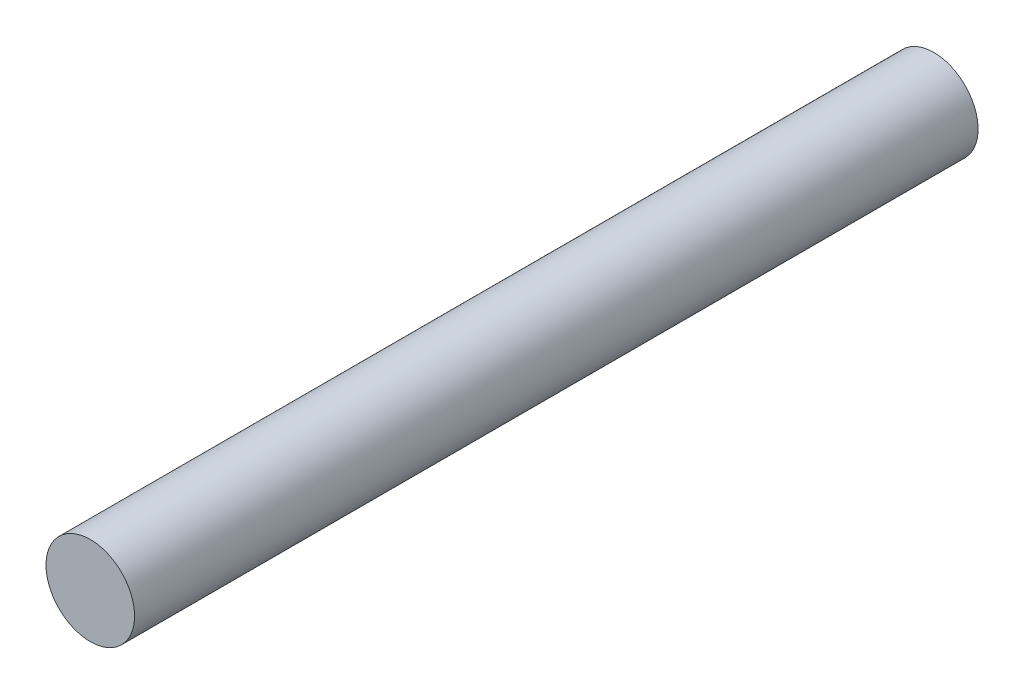
ISO-10303-21;
HEADER;
FILE_DESCRIPTION(('STEP AP214'),'2;1');
FILE_NAME('part.step','',(''),(''),'','','');
FILE_SCHEMA(('AUTOMOTIVE_DESIGN { 1 0 10303 214 1 1 1 1 }'));
ENDSEC;
DATA;
#1=APPLICATION_CONTEXT('core data for automotive mechanical design processes');
#2=APPLICATION_PROTOCOL_DEFINITION('international standard','automotive_design',2000,#1);
#3=PRODUCT_CONTEXT('',#1,'mechanical');
#4=PRODUCT('Part','Part','',(#3));
#5=PRODUCT_RELATED_PRODUCT_CATEGORY('part','',(#4));
#6=PRODUCT_DEFINITION_FORMATION('','',#4);
#7=PRODUCT_DEFINITION_CONTEXT('part definition',#1,'design');
#8=PRODUCT_DEFINITION('design','',#6,#7);
#9=PRODUCT_DEFINITION_SHAPE('','',#8);
#10=(LENGTH_UNIT() NAMED_UNIT(*) SI_UNIT(.MILLI.,.METRE.));
#11=(NAMED_UNIT(*) PLANE_ANGLE_UNIT() SI_UNIT($,.RADIAN.));
#12=(NAMED_UNIT(*) SI_UNIT($,.STERADIAN.) SOLID_ANGLE_UNIT());
#13=UNCERTAINTY_MEASURE_WITH_UNIT(LENGTH_MEASURE(1.E-05),#10,'distance_accuracy_value','');
#14=(GEOMETRIC_REPRESENTATION_CONTEXT(3) GLOBAL_UNCERTAINTY_ASSIGNED_CONTEXT((#13)) GLOBAL_UNIT_ASSIGNED_CONTEXT((#10,
#11,#12)) REPRESENTATION_CONTEXT('',''));
#15=CARTESIAN_POINT('',(0.,0.,0.));
#16=DIRECTION('',(0.,0.,1.));
#17=DIRECTION('',(1.,0.,0.));
#18=AXIS2_PLACEMENT_3D('',#15,#16,#17);
#19=CARTESIAN_POINT('',(0.,0.,76.2));
#20=DIRECTION('',(0.,0.,-1.));
#21=DIRECTION('',(-1.,0.,0.));
#22=AXIS2_PLACEMENT_3D('',#19,#20,#21);
#23=CYLINDRICAL_SURFACE('',#22,4.);
#24=CARTESIAN_POINT('',(0.,0.,76.2));
#25=DIRECTION('',(0.,0.,1.));
#26=DIRECTION('',(1.,0.,0.));
#27=AXIS2_PLACEMENT_3D('',#24,#25,#26);
#28=CIRCLE('',#27,4.);
#29=CARTESIAN_POINT('',(-4.,0.,76.2));
#30=VERTEX_POINT('',#29);
#31=EDGE_CURVE('E10',#30,#30,#28,.T.);
#32=CARTESIAN_POINT('',(0.,0.,0.));
#33=DIRECTION('',(0.,0.,1.));
#34=DIRECTION('',(1.,0.,0.));
#35=AXIS2_PLACEMENT_3D('',#32,#33,#34);
#36=CIRCLE('',#35,4.);
#37=CARTESIAN_POINT('',(-4.,0.,0.));
#38=VERTEX_POINT('',#37);
#39=EDGE_CURVE('E40',#38,#38,#36,.T.);
#40=CARTESIAN_POINT('',(-4.,0.,76.2));
#41=CARTESIAN_POINT('',(-4.,0.,75.40625));
#42=CARTESIAN_POINT('',(-4.,0.,74.6125));
#43=CARTESIAN_POINT('',(-4.,0.,73.025));
#44=CARTESIAN_POINT('',(-4.,0.,72.23125));
#45=CARTESIAN_POINT('',(-4.,0.,70.64375));
#46=CARTESIAN_POINT('',(-4.,0.,69.85));
#47=CARTESIAN_POINT('',(-4.,0.,68.2625));
#48=CARTESIAN_POINT('',(-4.,0.,67.46875));
#49=CARTESIAN_POINT('',(-4.,0.,65.88125));
#50=CARTESIAN_POINT('',(-4.,0.,65.0875));
#51=CARTESIAN_POINT('',(-4.,0.,63.5));
#52=CARTESIAN_POINT('',(-4.,0.,62.70625));
#53=CARTESIAN_POINT('',(-4.,0.,61.11875));
#54=CARTESIAN_POINT('',(-4.,0.,60.325));
#55=CARTESIAN_POINT('',(-4.,0.,58.7375));
#56=CARTESIAN_POINT('',(-4.,0.,57.94375));
#57=CARTESIAN_POINT('',(-4.,0.,56.35625));
#58=CARTESIAN_POINT('',(-4.,0.,55.5625));
#59=CARTESIAN_POINT('',(-4.,0.,53.975));
#60=CARTESIAN_POINT('',(-4.,0.,53.18125));
#61=CARTESIAN_POINT('',(-4.,0.,51.59375));
#62=CARTESIAN_POINT('',(-4.,0.,50.8));
#63=CARTESIAN_POINT('',(-4.,0.,49.2125));
#64=CARTESIAN_POINT('',(-4.,0.,48.41875));
#65=CARTESIAN_POINT('',(-4.,0.,46.83125));
#66=CARTESIAN_POINT('',(-4.,0.,46.0375));
#67=CARTESIAN_POINT('',(-4.,0.,44.45));
#68=CARTESIAN_POINT('',(-4.,0.,43.65625));
#69=CARTESIAN_POINT('',(-4.,0.,42.06875));
#70=CARTESIAN_POINT('',(-4.,0.,41.275));
#71=CARTESIAN_POINT('',(-4.,0.,39.6875));
#72=CARTESIAN_POINT('',(-4.,0.,38.89375));
#73=CARTESIAN_POINT('',(-4.,0.,37.30625));
#74=CARTESIAN_POINT('',(-4.,0.,36.5125));
#75=CARTESIAN_POINT('',(-4.,0.,34.925));
#76=CARTESIAN_POINT('',(-4.,0.,34.13125));
#77=CARTESIAN_POINT('',(-4.,0.,32.54375));
#78=CARTESIAN_POINT('',(-4.,0.,31.75));
#79=CARTESIAN_POINT('',(-4.,0.,30.1625));
#80=CARTESIAN_POINT('',(-4.,0.,29.36875));
#81=CARTESIAN_POINT('',(-4.,0.,27.78125));
#82=CARTESIAN_POINT('',(-4.,0.,26.9875));
#83=CARTESIAN_POINT('',(-4.,0.,25.4));
#84=CARTESIAN_POINT('',(-4.,0.,24.60625));
#85=CARTESIAN_POINT('',(-4.,0.,23.01875));
#86=CARTESIAN_POINT('',(-4.,0.,22.225));
#87=CARTESIAN_POINT('',(-4.,0.,20.6375));
#88=CARTESIAN_POINT('',(-4.,0.,19.84375));
#89=CARTESIAN_POINT('',(-4.,0.,18.25625));
#90=CARTESIAN_POINT('',(-4.,0.,17.4625));
#91=CARTESIAN_POINT('',(-4.,0.,15.875));
#92=CARTESIAN_POINT('',(-4.,0.,15.08125));
#93=CARTESIAN_POINT('',(-4.,0.,13.49375));
#94=CARTESIAN_POINT('',(-4.,0.,12.7));
#95=CARTESIAN_POINT('',(-4.,0.,11.1125));
#96=CARTESIAN_POINT('',(-4.,0.,10.31875));
#97=CARTESIAN_POINT('',(-4.,0.,8.73125));
#98=CARTESIAN_POINT('',(-4.,0.,7.93750000000001));
#99=CARTESIAN_POINT('',(-4.,0.,6.35));
#100=CARTESIAN_POINT('',(-4.,0.,5.55625));
#101=CARTESIAN_POINT('',(-4.,0.,3.96875));
#102=CARTESIAN_POINT('',(-4.,0.,3.175));
#103=CARTESIAN_POINT('',(-4.,0.,1.5875));
#104=CARTESIAN_POINT('',(-4.,0.,0.793750000000001));
#105=CARTESIAN_POINT('',(-4.,0.,0.));
#106=B_SPLINE_CURVE_WITH_KNOTS('',3,(#40,#41,#42,#43,#44,#45,#46,#47,#48,#49,#50,#51,#52,#53,
#54,#55,#56,#57,#58,#59,#60,#61,#62,#63,#64,#65,#66,#67,#68,#69,#70,#71,#72,#73,#74,#75,#76,#77,
#78,#79,#80,#81,#82,#83,#84,#85,#86,#87,#88,#89,#90,#91,#92,#93,#94,#95,#96,#97,#98,#99,#100,
#101,#102,#103,#104,#105),.UNSPECIFIED.,.F.,.F.,(4,2,2,2,2,2,2,2,2,2,2,2,2,2,2,2,2,2,2,2,2,2,2,
2,2,2,2,2,2,2,2,2,4),(0.,2.38124999999999,4.76249999999999,7.14374999999999,9.52499999999999,
11.90625,14.2875,16.66875,19.05,21.43125,23.8125,26.19375,28.575,30.95625,33.3375,35.71875,38.1,
40.48125,42.8625,45.24375,47.625,50.00625,52.3875,54.76875,57.15,59.53125,61.9125,64.29375,
66.675,69.05625,71.4375,73.81875,76.2),.UNSPECIFIED.);
#107=EDGE_CURVE('BSEAM37',#30,#38,#106,.T.);
#108=ORIENTED_EDGE('',*,*,#31,.F.);
#109=ORIENTED_EDGE('',*,*,#39,.T.);
#110=ORIENTED_EDGE('',*,*,#107,.T.);
#111=ORIENTED_EDGE('',*,*,#107,.F.);
#112=EDGE_LOOP('',(#108,#110,#109,#111));
#113=FACE_BOUND('',#112,.T.);
#114=ADVANCED_FACE('F37',(#113),#23,.T.);
#115=CARTESIAN_POINT('',(0.,0.,76.2));
#116=DIRECTION('',(0.,0.,1.));
#117=DIRECTION('',(1.,0.,0.));
#118=AXIS2_PLACEMENT_3D('',#115,#116,#117);
#119=PLANE('',#118);
#120=ORIENTED_EDGE('',*,*,#31,.T.);
#121=EDGE_LOOP('',(#120));
#122=FACE_BOUND('',#121,.T.);
#123=ADVANCED_FACE('F54',(#122),#119,.T.);
#124=CARTESIAN_POINT('',(0.,0.,0.));
#125=DIRECTION('',(0.,0.,1.));
#126=DIRECTION('',(1.,0.,0.));
#127=AXIS2_PLACEMENT_3D('',#124,#125,#126);
#128=PLANE('',#127);
#129=ORIENTED_EDGE('',*,*,#39,.F.);
#130=EDGE_LOOP('',(#129));
#131=FACE_BOUND('',#130,.T.);
#132=ADVANCED_FACE('F52',(#131),#128,.F.);
#133=CLOSED_SHELL('',(#114,#123,#132));
#134=MANIFOLD_SOLID_BREP('B2',#133);
#135=ADVANCED_BREP_SHAPE_REPRESENTATION('',(#18,#134),#14);
#136=SHAPE_DEFINITION_REPRESENTATION(#9,#135);
ENDSEC;
END-ISO-10303-21;
